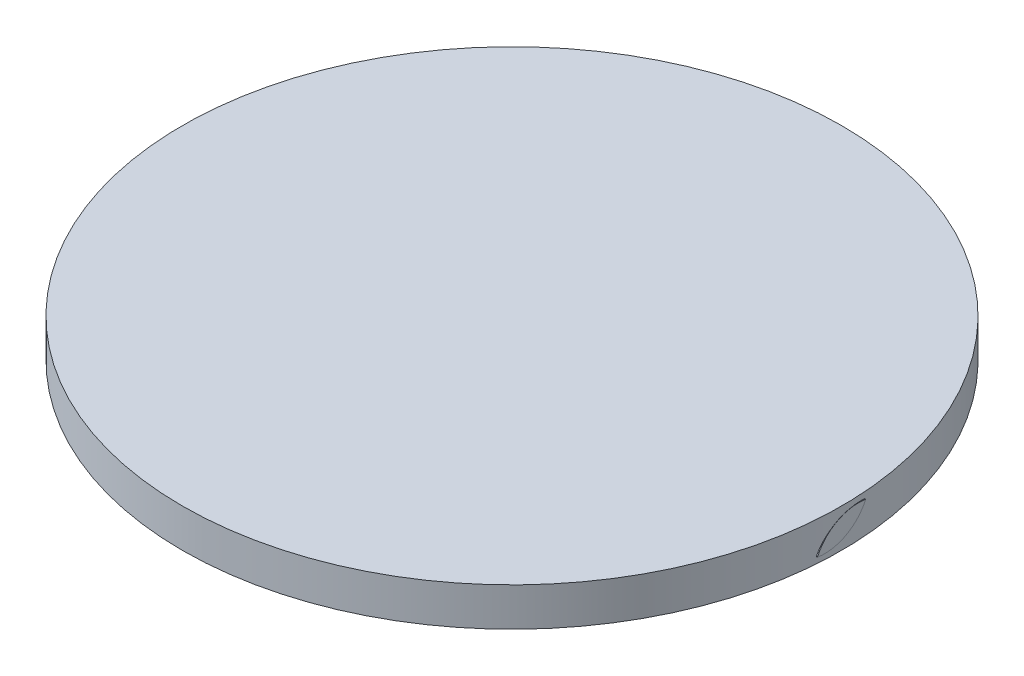
ISO-10303-21;
HEADER;
FILE_DESCRIPTION(('STEP AP214'),'2;1');
FILE_NAME('part.step','',(''),(''),'','','');
FILE_SCHEMA(('AUTOMOTIVE_DESIGN { 1 0 10303 214 1 1 1 1 }'));
ENDSEC;
DATA;
#1=APPLICATION_CONTEXT('core data for automotive mechanical design processes');
#2=APPLICATION_PROTOCOL_DEFINITION('international standard','automotive_design',2000,#1);
#3=PRODUCT_CONTEXT('',#1,'mechanical');
#4=PRODUCT('Part','Part','',(#3));
#5=PRODUCT_RELATED_PRODUCT_CATEGORY('part','',(#4));
#6=PRODUCT_DEFINITION_FORMATION('','',#4);
#7=PRODUCT_DEFINITION_CONTEXT('part definition',#1,'design');
#8=PRODUCT_DEFINITION('design','',#6,#7);
#9=PRODUCT_DEFINITION_SHAPE('','',#8);
#10=(LENGTH_UNIT() NAMED_UNIT(*) SI_UNIT(.MILLI.,.METRE.));
#11=(NAMED_UNIT(*) PLANE_ANGLE_UNIT() SI_UNIT($,.RADIAN.));
#12=(NAMED_UNIT(*) SI_UNIT($,.STERADIAN.) SOLID_ANGLE_UNIT());
#13=UNCERTAINTY_MEASURE_WITH_UNIT(LENGTH_MEASURE(1.E-05),#10,'distance_accuracy_value','');
#14=(GEOMETRIC_REPRESENTATION_CONTEXT(3) GLOBAL_UNCERTAINTY_ASSIGNED_CONTEXT((#13)) GLOBAL_UNIT_ASSIGNED_CONTEXT((#10,
#11,#12)) REPRESENTATION_CONTEXT('',''));
#15=CARTESIAN_POINT('',(0.,0.,0.));
#16=DIRECTION('',(0.,0.,1.));
#17=DIRECTION('',(1.,0.,0.));
#18=AXIS2_PLACEMENT_3D('',#15,#16,#17);
#19=CARTESIAN_POINT('',(0.,176.705627484771,0.));
#20=DIRECTION('',(0.,-1.,0.));
#21=DIRECTION('',(0.,0.,-1.));
#22=AXIS2_PLACEMENT_3D('',#19,#20,#21);
#23=CYLINDRICAL_SURFACE('',#22,60.);
#24=CARTESIAN_POINT('',(0.,0.,0.));
#25=DIRECTION('',(0.,1.,0.));
#26=DIRECTION('',(0.,0.,1.));
#27=AXIS2_PLACEMENT_3D('',#24,#25,#26);
#28=CIRCLE('',#27,60.);
#29=CARTESIAN_POINT('',(0.,0.,60.));
#30=VERTEX_POINT('',#29);
#31=EDGE_CURVE('E65',#30,#30,#28,.T.);
#32=ORIENTED_EDGE('',*,*,#31,.T.);
#33=EDGE_LOOP('',(#32));
#34=FACE_BOUND('',#33,.T.);
#35=CARTESIAN_POINT('',(0.,7.00000000000001,0.));
#36=DIRECTION('',(0.,1.,0.));
#37=DIRECTION('',(0.,0.,1.));
#38=AXIS2_PLACEMENT_3D('',#35,#36,#37);
#39=CIRCLE('',#38,60.);
#40=CARTESIAN_POINT('',(0.,7.00000000000001,60.));
#41=VERTEX_POINT('',#40);
#42=EDGE_CURVE('E11',#41,#41,#39,.T.);
#43=ORIENTED_EDGE('',*,*,#42,.F.);
#44=EDGE_LOOP('',(#43));
#45=FACE_BOUND('',#44,.T.);
#46=ADVANCED_FACE('F57',(#34,#45),#23,.T.);
#47=CARTESIAN_POINT('',(0.,0.,0.));
#48=DIRECTION('',(0.,1.,0.));
#49=DIRECTION('',(0.,0.,1.));
#50=AXIS2_PLACEMENT_3D('',#47,#48,#49);
#51=PLANE('',#50);
#52=ORIENTED_EDGE('',*,*,#31,.F.);
#53=EDGE_LOOP('',(#52));
#54=FACE_BOUND('',#53,.T.);
#55=ADVANCED_FACE('F74',(#54),#51,.F.);
#56=CARTESIAN_POINT('',(0.,7.,0.));
#57=DIRECTION('',(0.,1.,0.));
#58=DIRECTION('',(0.,0.,-1.));
#59=AXIS2_PLACEMENT_3D('',#56,#57,#58);
#60=PLANE('',#59);
#61=ORIENTED_EDGE('',*,*,#42,.T.);
#62=EDGE_LOOP('',(#61));
#63=FACE_BOUND('',#62,.T.);
#64=ADVANCED_FACE('F59',(#63),#60,.T.);
#65=CLOSED_SHELL('',(#46,#55,#64));
#66=MANIFOLD_SOLID_BREP('B2',#65);
#67=CARTESIAN_POINT('',(0.,7.,0.));
#68=DIRECTION('',(0.,1.,0.));
#69=DIRECTION('',(0.,0.,-1.));
#70=AXIS2_PLACEMENT_3D('',#67,#68,#69);
#71=PLANE('',#70);
#72=CARTESIAN_POINT('',(0.,7.,0.));
#73=DIRECTION('',(0.,-1.,0.));
#74=DIRECTION('',(0.,0.,-1.));
#75=AXIS2_PLACEMENT_3D('',#72,#73,#74);
#76=CIRCLE('',#75,6.5);
#77=CARTESIAN_POINT('',(0.,7.,-6.5));
#78=VERTEX_POINT('',#77);
#79=EDGE_CURVE('E193',#78,#78,#76,.T.);
#80=ORIENTED_EDGE('',*,*,#79,.F.);
#81=EDGE_LOOP('',(#80));
#82=FACE_BOUND('',#81,.T.);
#83=CARTESIAN_POINT('',(0.,7.,0.));
#84=DIRECTION('',(0.,-1.,0.));
#85=DIRECTION('',(0.,0.,-1.));
#86=AXIS2_PLACEMENT_3D('',#83,#84,#85);
#87=CIRCLE('',#86,2.5);
#88=CARTESIAN_POINT('',(0.,7.,-2.5));
#89=VERTEX_POINT('',#88);
#90=EDGE_CURVE('E187',#89,#89,#87,.T.);
#91=ORIENTED_EDGE('',*,*,#90,.T.);
#92=EDGE_LOOP('',(#91));
#93=FACE_BOUND('',#92,.T.);
#94=ADVANCED_FACE('F114',(#82,#93),#71,.T.);
#95=CARTESIAN_POINT('',(0.,0.,0.));
#96=DIRECTION('',(0.,1.,0.));
#97=DIRECTION('',(0.,0.,-1.));
#98=AXIS2_PLACEMENT_3D('',#95,#96,#97);
#99=PLANE('',#98);
#100=CARTESIAN_POINT('',(0.,0.,0.));
#101=DIRECTION('',(0.,-1.,0.));
#102=DIRECTION('',(0.,0.,-1.));
#103=AXIS2_PLACEMENT_3D('',#100,#101,#102);
#104=CIRCLE('',#103,6.5);
#105=CARTESIAN_POINT('',(0.,0.,-6.5));
#106=VERTEX_POINT('',#105);
#107=EDGE_CURVE('E190',#106,#106,#104,.T.);
#108=ORIENTED_EDGE('',*,*,#107,.T.);
#109=EDGE_LOOP('',(#108));
#110=FACE_BOUND('',#109,.T.);
#111=CARTESIAN_POINT('',(0.,0.,0.));
#112=DIRECTION('',(0.,-1.,0.));
#113=DIRECTION('',(0.,0.,-1.));
#114=AXIS2_PLACEMENT_3D('',#111,#112,#113);
#115=CIRCLE('',#114,2.5);
#116=CARTESIAN_POINT('',(0.,0.,-2.5));
#117=VERTEX_POINT('',#116);
#118=EDGE_CURVE('E186',#117,#117,#115,.T.);
#119=ORIENTED_EDGE('',*,*,#118,.F.);
#120=EDGE_LOOP('',(#119));
#121=FACE_BOUND('',#120,.T.);
#122=ADVANCED_FACE('F227',(#110,#121),#99,.F.);
#123=CARTESIAN_POINT('',(0.,7.,0.));
#124=DIRECTION('',(0.,-1.,0.));
#125=DIRECTION('',(0.,0.,1.));
#126=AXIS2_PLACEMENT_3D('',#123,#124,#125);
#127=CYLINDRICAL_SURFACE('',#126,6.5);
#128=CARTESIAN_POINT('',(-4.7821821436501,5.87049911517509,4.40235549961087));
#129=CARTESIAN_POINT('',(-4.83064414254382,5.75307849011286,4.34971721674044));
#130=CARTESIAN_POINT('',(-4.87990007531833,5.63718924817442,4.29446194755524));
#131=CARTESIAN_POINT('',(-4.97934252504515,5.40844816549399,4.1787508646116));
#132=CARTESIAN_POINT('',(-5.02952902312219,5.29559626325717,4.11829515624686));
#133=CARTESIAN_POINT('',(-5.18064033294913,4.96124427834919,3.92900023104887));
#134=CARTESIAN_POINT('',(-5.28197964130929,4.74427172089679,3.79237859337446));
#135=CARTESIAN_POINT('',(-5.48201816255056,4.32081778718442,3.49709020025005));
#136=CARTESIAN_POINT('',(-5.58068011473167,4.11446532399425,3.33821366554871));
#137=CARTESIAN_POINT('',(-5.76977191253925,3.71578718343125,2.99954925464827));
#138=CARTESIAN_POINT('',(-5.8602087829891,3.52344956480868,2.81977952748504));
#139=CARTESIAN_POINT('',(-6.00082777656387,3.21498198799895,2.50191697257492));
#140=CARTESIAN_POINT('',(-6.05448191443204,3.09455355994512,2.36950239094969));
#141=CARTESIAN_POINT('',(-6.15469441903155,2.8614116783889,2.09547389795706));
#142=CARTESIAN_POINT('',(-6.2012531335545,2.74869784689459,1.95386043797053));
#143=CARTESIAN_POINT('',(-6.28565115537736,2.53222289336979,1.66238370282706));
#144=CARTESIAN_POINT('',(-6.32352442507828,2.42842792820188,1.51255550140705));
#145=CARTESIAN_POINT('',(-6.38931550033209,2.23017901748577,1.20474113971181));
#146=CARTESIAN_POINT('',(-6.41723496009312,2.13572352171302,1.04675633996961));
#147=CARTESIAN_POINT('',(-6.45807981110886,1.97148438860737,0.749617808270409));
#148=CARTESIAN_POINT('',(-6.47269726112326,1.9001786123533,0.611536570397726));
#149=CARTESIAN_POINT('',(-6.49308830236873,1.76531312347445,0.331015669890624));
#150=CARTESIAN_POINT('',(-6.49886353682219,1.70175197362269,0.188576822086766));
#151=CARTESIAN_POINT('',(-6.5008332970216,1.58282493814278,-0.0997949089279416));
#152=CARTESIAN_POINT('',(-6.49702583145035,1.52746075840377,-0.245728512119164));
#153=CARTESIAN_POINT('',(-6.47920924664528,1.42531356801808,-0.539970665864429));
#154=CARTESIAN_POINT('',(-6.46520004465342,1.37853062698755,-0.688279235675013));
#155=CARTESIAN_POINT('',(-6.42646291900958,1.2936248860239,-0.98654203323697));
#156=CARTESIAN_POINT('',(-6.40169816750957,1.25553253309935,-1.13650017414418));
#157=CARTESIAN_POINT('',(-6.34118974554054,1.1882546389773,-1.43620416867612));
#158=CARTESIAN_POINT('',(-6.30544594839662,1.15906920055443,-1.58595001983144));
#159=CARTESIAN_POINT('',(-6.22293221814679,1.10942888764528,-1.88388290383165));
#160=CARTESIAN_POINT('',(-6.17615939530979,1.08897630522161,-2.03206951749061));
#161=CARTESIAN_POINT('',(-6.07176373348164,1.05643172809972,-2.32549620563955));
#162=CARTESIAN_POINT('',(-6.01414150407575,1.04433926385776,-2.47073644516701));
#163=CARTESIAN_POINT('',(-5.89217105962823,1.02842920447622,-2.74844052835948));
#164=CARTESIAN_POINT('',(-5.82843389016116,1.02415862684524,-2.88114807508317));
#165=CARTESIAN_POINT('',(-5.69204358803965,1.02188505103255,-3.14202373699236));
#166=CARTESIAN_POINT('',(-5.61938651443232,1.02388483283838,-3.2701898132265));
#167=CARTESIAN_POINT('',(-5.46574838862474,1.03344831091795,-3.52096503731605));
#168=CARTESIAN_POINT('',(-5.38477843115619,1.04100467210471,-3.64358128503876));
#169=CARTESIAN_POINT('',(-5.21492630139397,1.06090737931176,-3.8827896587537));
#170=CARTESIAN_POINT('',(-5.12604478774283,1.07325332688252,-3.99938228494179));
#171=CARTESIAN_POINT('',(-4.99295337664244,1.09386181536266,-4.16227380811089));
#172=CARTESIAN_POINT('',(-4.95171979968998,1.10051822811231,-4.21124271502949));
#173=CARTESIAN_POINT('',(-4.86793984185861,1.11451360770791,-4.30781148946805));
#174=CARTESIAN_POINT('',(-4.82539557012069,1.12185151269691,-4.35541334039849));
#175=CARTESIAN_POINT('',(-4.7821821436501,1.12950088482491,-4.40235549961088));
#176=B_SPLINE_CURVE_WITH_KNOTS('',3,(#128,#129,#130,#131,#132,#133,#134,#135,#136,#137,#138,
#139,#140,#141,#142,#143,#144,#145,#146,#147,#148,#149,#150,#151,#152,#153,#154,#155,#156,#157,
#158,#159,#160,#161,#162,#163,#164,#165,#166,#167,#168,#169,#170,#171,#172,#173,#174,#175),
.UNSPECIFIED.,.F.,.F.,(4,2,2,2,2,2,2,2,2,2,2,2,2,2,2,2,2,2,2,2,2,2,2,4),(0.,0.412424395206687,
0.82484043406315,1.65081032526283,2.48516794300089,3.31880613151439,3.87892439803388,
4.43901520077476,4.99687706559019,5.55464617694931,6.02245501526971,6.49017690622934,
6.95799599939028,7.42581888761249,7.89525642556378,8.36469938003175,8.83426547087328,
9.30380518652116,9.74517092170496,10.186732365718,10.6277119606797,11.068654878059,
11.2617154359852,11.4544800709796),.UNSPECIFIED.);
#177=CARTESIAN_POINT('',(-4.7821821436501,5.87049911517509,4.40235549961087));
#178=VERTEX_POINT('',#177);
#179=CARTESIAN_POINT('',(-4.7821821436501,1.12950088482491,-4.40235549961088));
#180=VERTEX_POINT('',#179);
#181=EDGE_CURVE('E128',#178,#180,#176,.T.);
#182=ORIENTED_EDGE('',*,*,#181,.T.);
#183=CARTESIAN_POINT('',(-4.7821821436501,5.87049911517509,4.40235549961088));
#184=CARTESIAN_POINT('',(-4.88766320937093,5.88917689213438,4.28779478186393));
#185=CARTESIAN_POINT('',(-4.98918102694404,5.90599145402247,4.1692347784361));
#186=CARTESIAN_POINT('',(-5.18373646436622,5.93492352011488,3.92469811394374));
#187=CARTESIAN_POINT('',(-5.27676895914507,5.94703819980915,3.79871704522361));
#188=CARTESIAN_POINT('',(-5.45390508052464,5.96559953020935,3.53971840560347));
#189=CARTESIAN_POINT('',(-5.53798453135131,5.97203116016814,3.40668316670556));
#190=CARTESIAN_POINT('',(-5.69631529261127,5.97825307352717,3.13476219869654));
#191=CARTESIAN_POINT('',(-5.77056859359833,5.97804470411424,2.99587766205773));
#192=CARTESIAN_POINT('',(-5.90902452010194,5.97015178852389,2.7126339773875));
#193=CARTESIAN_POINT('',(-5.97318239980489,5.96243499029153,2.5682537944861));
#194=CARTESIAN_POINT('',(-6.09061712125845,5.93878951745358,2.27578802159962));
#195=CARTESIAN_POINT('',(-6.143894564103,5.92286129666264,2.12770263681749));
#196=CARTESIAN_POINT('',(-6.23919524526895,5.88232936195132,1.82945377606943));
#197=CARTESIAN_POINT('',(-6.2812413370792,5.85774350469477,1.67929518404446));
#198=CARTESIAN_POINT('',(-6.35414107008765,5.79959817224028,1.37800941725758));
#199=CARTESIAN_POINT('',(-6.38499543844963,5.76603928029667,1.22688230607313));
#200=CARTESIAN_POINT('',(-6.43408462201875,5.69224109164672,0.934431088851243));
#201=CARTESIAN_POINT('',(-6.45298339903484,5.6525451699426,0.793080285373248));
#202=CARTESIAN_POINT('',(-6.48135958439274,5.56528877725754,0.511822618964511));
#203=CARTESIAN_POINT('',(-6.49083393072099,5.51772575609254,0.37191623993084));
#204=CARTESIAN_POINT('',(-6.50079430575211,5.41496777714514,0.0945553993063757));
#205=CARTESIAN_POINT('',(-6.50127670984996,5.35976975076334,-0.0428980512188811));
#206=CARTESIAN_POINT('',(-6.49381060852867,5.24208690036674,-0.314461143915668));
#207=CARTESIAN_POINT('',(-6.48585889341083,5.17959931028395,-0.448569493185438));
#208=CARTESIAN_POINT('',(-6.46174288433414,5.04537183343341,-0.71746273944143));
#209=CARTESIAN_POINT('',(-6.44529056218441,4.97337818717153,-0.852095019370883));
#210=CARTESIAN_POINT('',(-6.40482220603737,4.82253172550726,-1.11630581914759));
#211=CARTESIAN_POINT('',(-6.38080324747632,4.74367626650476,-1.24588236311385));
#212=CARTESIAN_POINT('',(-6.29860688419894,4.49756347741591,-1.62627681221982));
#213=CARTESIAN_POINT('',(-6.23028134221334,4.32071652591468,-1.86884552350102));
#214=CARTESIAN_POINT('',(-6.0921229865514,3.99071984324681,-2.27382257665893));
#215=CARTESIAN_POINT('',(-6.02658747160085,3.84206916771191,-2.44149744698916));
#216=CARTESIAN_POINT('',(-5.88646051027415,3.53368082112882,-2.76227885246882));
#217=CARTESIAN_POINT('',(-5.81186812654432,3.37394200323139,-2.91538387676101));
#218=CARTESIAN_POINT('',(-5.65617457478009,3.04423666969009,-3.20703367607814));
#219=CARTESIAN_POINT('',(-5.5750638463006,2.87425522604331,-3.34555634963119));
#220=CARTESIAN_POINT('',(-5.40909081937207,2.52506245031342,-3.60774116249649));
#221=CARTESIAN_POINT('',(-5.32423002717874,2.34585481934524,-3.73140919545121));
#222=CARTESIAN_POINT('',(-5.16194158894226,1.9968586946429,-3.95236702600692));
#223=CARTESIAN_POINT('',(-5.0846145929603,1.82790748868391,-4.05105713321269));
#224=CARTESIAN_POINT('',(-4.93165976988153,1.4836157561563,-4.23593553183121));
#225=CARTESIAN_POINT('',(-4.85602617742722,1.30830499222131,-4.32217451101261));
#226=CARTESIAN_POINT('',(-4.7821821436501,1.12950088482492,-4.40235549961087));
#227=B_SPLINE_CURVE_WITH_KNOTS('',3,(#183,#184,#185,#186,#187,#188,#189,#190,#191,#192,#193,
#194,#195,#196,#197,#198,#199,#200,#201,#202,#203,#204,#205,#206,#207,#208,#209,#210,#211,#212,
#213,#214,#215,#216,#217,#218,#219,#220,#221,#222,#223,#224,#225,#226),.UNSPECIFIED.,.F.,.F.,(4,
2,2,2,2,2,2,2,2,2,2,2,2,2,2,2,2,2,2,2,2,4),(0.,0.470464893316255,0.941212087728027,
1.41319981398858,1.88509177945657,2.35901972085607,2.83292147283703,3.30585145706237,
3.77875070793549,4.22232193884454,4.66603723977526,5.10993139616443,5.553994542087,
6.01419983299027,6.47458321549889,7.39506275987095,8.09462715183295,8.79426400803377,
9.4949464349293,10.1953499383263,10.8260555117164,11.4541163880461),.UNSPECIFIED.);
#228=EDGE_CURVE('E55',#178,#180,#227,.T.);
#229=ORIENTED_EDGE('',*,*,#228,.F.);
#230=EDGE_LOOP('',(#182,#229));
#231=FACE_BOUND('',#230,.T.);
#232=CARTESIAN_POINT('',(4.7821821436501,5.87049911517509,-4.40235549961087));
#233=CARTESIAN_POINT('',(4.83064414254382,5.75307849011286,-4.34971721674044));
#234=CARTESIAN_POINT('',(4.87990007531833,5.63718924817442,-4.29446194755524));
#235=CARTESIAN_POINT('',(4.97934252504515,5.40844816549399,-4.1787508646116));
#236=CARTESIAN_POINT('',(5.02952902312219,5.29559626325717,-4.11829515624686));
#237=CARTESIAN_POINT('',(5.18064033294913,4.96124427834919,-3.92900023104887));
#238=CARTESIAN_POINT('',(5.28197964130929,4.74427172089679,-3.79237859337446));
#239=CARTESIAN_POINT('',(5.48201816255056,4.32081778718442,-3.49709020025005));
#240=CARTESIAN_POINT('',(5.58068011473167,4.11446532399425,-3.33821366554871));
#241=CARTESIAN_POINT('',(5.76977191253925,3.71578718343125,-2.99954925464827));
#242=CARTESIAN_POINT('',(5.8602087829891,3.52344956480868,-2.81977952748504));
#243=CARTESIAN_POINT('',(6.00082777656387,3.21498198799895,-2.50191697257492));
#244=CARTESIAN_POINT('',(6.05448191443204,3.09455355994512,-2.36950239094969));
#245=CARTESIAN_POINT('',(6.15469441903155,2.8614116783889,-2.09547389795706));
#246=CARTESIAN_POINT('',(6.2012531335545,2.74869784689459,-1.95386043797053));
#247=CARTESIAN_POINT('',(6.28565115537736,2.53222289336979,-1.66238370282706));
#248=CARTESIAN_POINT('',(6.32352442507828,2.42842792820188,-1.51255550140705));
#249=CARTESIAN_POINT('',(6.38931550033209,2.23017901748577,-1.20474113971181));
#250=CARTESIAN_POINT('',(6.41723496009312,2.13572352171302,-1.04675633996961));
#251=CARTESIAN_POINT('',(6.45807981110886,1.97148438860737,-0.749617808270409));
#252=CARTESIAN_POINT('',(6.47269726112326,1.9001786123533,-0.611536570397726));
#253=CARTESIAN_POINT('',(6.49308830236873,1.76531312347445,-0.331015669890624));
#254=CARTESIAN_POINT('',(6.49886353682219,1.70175197362269,-0.188576822086766));
#255=CARTESIAN_POINT('',(6.5008332970216,1.58282493814278,0.0997949089279416));
#256=CARTESIAN_POINT('',(6.49702583145035,1.52746075840377,0.245728512119164));
#257=CARTESIAN_POINT('',(6.47920924664528,1.42531356801808,0.539970665864429));
#258=CARTESIAN_POINT('',(6.46520004465342,1.37853062698755,0.688279235675013));
#259=CARTESIAN_POINT('',(6.42646291900958,1.2936248860239,0.98654203323697));
#260=CARTESIAN_POINT('',(6.40169816750957,1.25553253309935,1.13650017414418));
#261=CARTESIAN_POINT('',(6.34118974554054,1.1882546389773,1.43620416867612));
#262=CARTESIAN_POINT('',(6.30544594839662,1.15906920055443,1.58595001983144));
#263=CARTESIAN_POINT('',(6.22293221814679,1.10942888764528,1.88388290383165));
#264=CARTESIAN_POINT('',(6.17615939530979,1.08897630522161,2.03206951749061));
#265=CARTESIAN_POINT('',(6.07176373348164,1.05643172809972,2.32549620563955));
#266=CARTESIAN_POINT('',(6.01414150407575,1.04433926385776,2.47073644516701));
#267=CARTESIAN_POINT('',(5.89217105962823,1.02842920447622,2.74844052835948));
#268=CARTESIAN_POINT('',(5.82843389016116,1.02415862684524,2.88114807508317));
#269=CARTESIAN_POINT('',(5.69204358803965,1.02188505103255,3.14202373699236));
#270=CARTESIAN_POINT('',(5.61938651443232,1.02388483283838,3.2701898132265));
#271=CARTESIAN_POINT('',(5.46574838862474,1.03344831091795,3.52096503731605));
#272=CARTESIAN_POINT('',(5.38477843115619,1.04100467210471,3.64358128503876));
#273=CARTESIAN_POINT('',(5.21492630139397,1.06090737931176,3.8827896587537));
#274=CARTESIAN_POINT('',(5.12604478774283,1.07325332688252,3.99938228494179));
#275=CARTESIAN_POINT('',(4.99295337664244,1.09386181536266,4.16227380811089));
#276=CARTESIAN_POINT('',(4.95171979968998,1.10051822811231,4.21124271502949));
#277=CARTESIAN_POINT('',(4.86793984185861,1.11451360770791,4.30781148946805));
#278=CARTESIAN_POINT('',(4.82539557012069,1.12185151269691,4.35541334039849));
#279=CARTESIAN_POINT('',(4.7821821436501,1.12950088482491,4.40235549961088));
#280=B_SPLINE_CURVE_WITH_KNOTS('',3,(#232,#233,#234,#235,#236,#237,#238,#239,#240,#241,#242,
#243,#244,#245,#246,#247,#248,#249,#250,#251,#252,#253,#254,#255,#256,#257,#258,#259,#260,#261,
#262,#263,#264,#265,#266,#267,#268,#269,#270,#271,#272,#273,#274,#275,#276,#277,#278,#279),
.UNSPECIFIED.,.F.,.F.,(4,2,2,2,2,2,2,2,2,2,2,2,2,2,2,2,2,2,2,2,2,2,2,4),(0.,0.412424395206687,
0.82484043406315,1.65081032526283,2.48516794300089,3.31880613151439,3.87892439803388,
4.43901520077476,4.99687706559019,5.55464617694931,6.02245501526971,6.49017690622934,
6.95799599939028,7.42581888761249,7.89525642556378,8.36469938003175,8.83426547087328,
9.30380518652116,9.74517092170496,10.186732365718,10.6277119606797,11.068654878059,
11.2617154359852,11.4544800709796),.UNSPECIFIED.);
#281=CARTESIAN_POINT('',(4.7821821436501,5.87049911517509,-4.40235549961087));
#282=VERTEX_POINT('',#281);
#283=CARTESIAN_POINT('',(4.7821821436501,1.12950088482491,4.40235549961088));
#284=VERTEX_POINT('',#283);
#285=EDGE_CURVE('E196',#282,#284,#280,.T.);
#286=ORIENTED_EDGE('',*,*,#285,.T.);
#287=CARTESIAN_POINT('',(4.7821821436501,5.87049911517509,-4.40235549961088));
#288=CARTESIAN_POINT('',(4.88766320937093,5.88917689213438,-4.28779478186393));
#289=CARTESIAN_POINT('',(4.98918102694404,5.90599145402247,-4.1692347784361));
#290=CARTESIAN_POINT('',(5.18373646436622,5.93492352011488,-3.92469811394374));
#291=CARTESIAN_POINT('',(5.27676895914507,5.94703819980915,-3.79871704522361));
#292=CARTESIAN_POINT('',(5.45390508052464,5.96559953020935,-3.53971840560347));
#293=CARTESIAN_POINT('',(5.53798453135131,5.97203116016814,-3.40668316670556));
#294=CARTESIAN_POINT('',(5.69631529261127,5.97825307352717,-3.13476219869654));
#295=CARTESIAN_POINT('',(5.77056859359833,5.97804470411424,-2.99587766205773));
#296=CARTESIAN_POINT('',(5.90902452010194,5.97015178852389,-2.7126339773875));
#297=CARTESIAN_POINT('',(5.97318239980489,5.96243499029153,-2.5682537944861));
#298=CARTESIAN_POINT('',(6.09061712125845,5.93878951745358,-2.27578802159962));
#299=CARTESIAN_POINT('',(6.143894564103,5.92286129666264,-2.12770263681749));
#300=CARTESIAN_POINT('',(6.23919524526895,5.88232936195132,-1.82945377606943));
#301=CARTESIAN_POINT('',(6.2812413370792,5.85774350469477,-1.67929518404446));
#302=CARTESIAN_POINT('',(6.35414107008765,5.79959817224028,-1.37800941725758));
#303=CARTESIAN_POINT('',(6.38499543844963,5.76603928029667,-1.22688230607313));
#304=CARTESIAN_POINT('',(6.43408462201875,5.69224109164672,-0.934431088851243));
#305=CARTESIAN_POINT('',(6.45298339903484,5.6525451699426,-0.793080285373248));
#306=CARTESIAN_POINT('',(6.48135958439274,5.56528877725754,-0.511822618964511));
#307=CARTESIAN_POINT('',(6.49083393072099,5.51772575609254,-0.37191623993084));
#308=CARTESIAN_POINT('',(6.50079430575211,5.41496777714514,-0.0945553993063757));
#309=CARTESIAN_POINT('',(6.50127670984996,5.35976975076334,0.0428980512188811));
#310=CARTESIAN_POINT('',(6.49381060852867,5.24208690036674,0.314461143915668));
#311=CARTESIAN_POINT('',(6.48585889341083,5.17959931028395,0.448569493185438));
#312=CARTESIAN_POINT('',(6.46174288433414,5.04537183343341,0.71746273944143));
#313=CARTESIAN_POINT('',(6.44529056218441,4.97337818717153,0.852095019370883));
#314=CARTESIAN_POINT('',(6.40482220603737,4.82253172550726,1.11630581914759));
#315=CARTESIAN_POINT('',(6.38080324747632,4.74367626650476,1.24588236311385));
#316=CARTESIAN_POINT('',(6.29860688419894,4.49756347741591,1.62627681221982));
#317=CARTESIAN_POINT('',(6.23028134221334,4.32071652591468,1.86884552350102));
#318=CARTESIAN_POINT('',(6.0921229865514,3.99071984324681,2.27382257665893));
#319=CARTESIAN_POINT('',(6.02658747160085,3.84206916771191,2.44149744698916));
#320=CARTESIAN_POINT('',(5.88646051027415,3.53368082112882,2.76227885246882));
#321=CARTESIAN_POINT('',(5.81186812654432,3.37394200323139,2.91538387676101));
#322=CARTESIAN_POINT('',(5.65617457478009,3.04423666969009,3.20703367607814));
#323=CARTESIAN_POINT('',(5.5750638463006,2.87425522604331,3.34555634963119));
#324=CARTESIAN_POINT('',(5.40909081937207,2.52506245031342,3.60774116249649));
#325=CARTESIAN_POINT('',(5.32423002717874,2.34585481934524,3.73140919545121));
#326=CARTESIAN_POINT('',(5.16194158894226,1.9968586946429,3.95236702600692));
#327=CARTESIAN_POINT('',(5.0846145929603,1.82790748868391,4.05105713321269));
#328=CARTESIAN_POINT('',(4.93165976988153,1.4836157561563,4.23593553183121));
#329=CARTESIAN_POINT('',(4.85602617742722,1.30830499222131,4.32217451101261));
#330=CARTESIAN_POINT('',(4.7821821436501,1.12950088482492,4.40235549961087));
#331=B_SPLINE_CURVE_WITH_KNOTS('',3,(#287,#288,#289,#290,#291,#292,#293,#294,#295,#296,#297,
#298,#299,#300,#301,#302,#303,#304,#305,#306,#307,#308,#309,#310,#311,#312,#313,#314,#315,#316,
#317,#318,#319,#320,#321,#322,#323,#324,#325,#326,#327,#328,#329,#330),.UNSPECIFIED.,.F.,.F.,(4,
2,2,2,2,2,2,2,2,2,2,2,2,2,2,2,2,2,2,2,2,4),(0.,0.470464893316255,0.941212087728027,
1.41319981398858,1.88509177945657,2.35901972085607,2.83292147283703,3.30585145706237,
3.77875070793549,4.22232193884454,4.66603723977526,5.10993139616443,5.553994542087,
6.01419983299027,6.47458321549889,7.39506275987095,8.09462715183295,8.79426400803377,
9.4949464349293,10.1953499383263,10.8260555117164,11.4541163880461),.UNSPECIFIED.);
#332=EDGE_CURVE('E206',#282,#284,#331,.T.);
#333=ORIENTED_EDGE('',*,*,#332,.F.);
#334=EDGE_LOOP('',(#286,#333));
#335=FACE_BOUND('',#334,.T.);
#336=ORIENTED_EDGE('',*,*,#79,.T.);
#337=EDGE_LOOP('',(#336));
#338=FACE_BOUND('',#337,.T.);
#339=ORIENTED_EDGE('',*,*,#107,.F.);
#340=EDGE_LOOP('',(#339));
#341=FACE_BOUND('',#340,.T.);
#342=ADVANCED_FACE('F116',(#231,#335,#338,#341),#127,.T.);
#343=CARTESIAN_POINT('',(0.,7.,0.));
#344=DIRECTION('',(0.,-1.,0.));
#345=DIRECTION('',(0.,0.,1.));
#346=AXIS2_PLACEMENT_3D('',#343,#344,#345);
#347=CYLINDRICAL_SURFACE('',#346,2.5);
#348=ORIENTED_EDGE('',*,*,#90,.F.);
#349=EDGE_LOOP('',(#348));
#350=FACE_BOUND('',#349,.T.);
#351=ORIENTED_EDGE('',*,*,#118,.T.);
#352=EDGE_LOOP('',(#351));
#353=FACE_BOUND('',#352,.T.);
#354=ADVANCED_FACE('F222',(#350,#353),#347,.F.);
#355=CARTESIAN_POINT('',(60.,-2.22565177037629,-3.08304326097185));
#356=DIRECTION('',(-1.,0.,0.));
#357=DIRECTION('',(0.,0.,-1.));
#358=AXIS2_PLACEMENT_3D('',#355,#356,#357);
#359=CYLINDRICAL_SURFACE('',#358,8.20294117647061);
#360=ORIENTED_EDGE('',*,*,#332,.T.);
#361=DIRECTION('',(-1.,0.,0.));
#362=VECTOR('',#361,1.);
#363=CARTESIAN_POINT('',(60.,1.12950088482491,4.40235549961088));
#364=LINE('',#363,#362);
#365=CARTESIAN_POINT('',(60.,1.12950088482491,4.40235549961088));
#366=VERTEX_POINT('',#365);
#367=EDGE_CURVE('E183',#366,#284,#364,.T.);
#368=ORIENTED_EDGE('',*,*,#367,.F.);
#369=CARTESIAN_POINT('',(60.,-2.22565177037629,-3.08304326097185));
#370=DIRECTION('',(-1.,0.,0.));
#371=DIRECTION('',(0.,0.,1.));
#372=AXIS2_PLACEMENT_3D('',#369,#370,#371);
#373=CIRCLE('',#372,8.20294117647061);
#374=CARTESIAN_POINT('',(60.,5.87049911517509,-4.40235549961088));
#375=VERTEX_POINT('',#374);
#376=EDGE_CURVE('E173',#375,#366,#373,.F.);
#377=ORIENTED_EDGE('',*,*,#376,.F.);
#378=DIRECTION('',(-1.,0.,0.));
#379=VECTOR('',#378,1.);
#380=CARTESIAN_POINT('',(60.,5.87049911517509,-4.40235549961088));
#381=LINE('',#380,#379);
#382=EDGE_CURVE('E142',#375,#282,#381,.T.);
#383=ORIENTED_EDGE('',*,*,#382,.T.);
#384=EDGE_LOOP('',(#360,#368,#377,#383));
#385=FACE_BOUND('',#384,.T.);
#386=ADVANCED_FACE('F217',(#385),#359,.T.);
#387=CARTESIAN_POINT('',(60.,9.2256517703763,3.08304326097185));
#388=DIRECTION('',(-1.,0.,0.));
#389=DIRECTION('',(0.,0.,-1.));
#390=AXIS2_PLACEMENT_3D('',#387,#388,#389);
#391=CYLINDRICAL_SURFACE('',#390,8.20294117647062);
#392=ORIENTED_EDGE('',*,*,#382,.F.);
#393=CARTESIAN_POINT('',(60.,9.2256517703763,3.08304326097185));
#394=DIRECTION('',(-1.,0.,0.));
#395=DIRECTION('',(0.,0.,1.));
#396=AXIS2_PLACEMENT_3D('',#393,#394,#395);
#397=CIRCLE('',#396,8.20294117647062);
#398=EDGE_CURVE('E181',#375,#366,#397,.T.);
#399=ORIENTED_EDGE('',*,*,#398,.T.);
#400=ORIENTED_EDGE('',*,*,#367,.T.);
#401=ORIENTED_EDGE('',*,*,#285,.F.);
#402=EDGE_LOOP('',(#392,#399,#400,#401));
#403=FACE_BOUND('',#402,.T.);
#404=ADVANCED_FACE('F212',(#403),#391,.T.);
#405=CARTESIAN_POINT('',(60.,0.,0.));
#406=DIRECTION('',(1.,0.,0.));
#407=DIRECTION('',(0.,0.,1.));
#408=AXIS2_PLACEMENT_3D('',#405,#406,#407);
#409=PLANE('',#408);
#410=ORIENTED_EDGE('',*,*,#376,.T.);
#411=ORIENTED_EDGE('',*,*,#398,.F.);
#412=EDGE_LOOP('',(#410,#411));
#413=FACE_BOUND('',#412,.T.);
#414=ADVANCED_FACE('F216',(#413),#409,.T.);
#415=CARTESIAN_POINT('',(-60.,-2.22565177037629,3.08304326097185));
#416=DIRECTION('',(1.,0.,0.));
#417=DIRECTION('',(0.,0.,1.));
#418=AXIS2_PLACEMENT_3D('',#415,#416,#417);
#419=CYLINDRICAL_SURFACE('',#418,8.20294117647061);
#420=ORIENTED_EDGE('',*,*,#228,.T.);
#421=DIRECTION('',(1.,0.,0.));
#422=VECTOR('',#421,1.);
#423=CARTESIAN_POINT('',(-60.,1.12950088482491,-4.40235549961088));
#424=LINE('',#423,#422);
#425=CARTESIAN_POINT('',(-60.,1.12950088482491,-4.40235549961088));
#426=VERTEX_POINT('',#425);
#427=EDGE_CURVE('E168',#426,#180,#424,.T.);
#428=ORIENTED_EDGE('',*,*,#427,.F.);
#429=CARTESIAN_POINT('',(-60.,-2.22565177037629,3.08304326097185));
#430=DIRECTION('',(1.,0.,0.));
#431=DIRECTION('',(0.,0.,-1.));
#432=AXIS2_PLACEMENT_3D('',#429,#430,#431);
#433=CIRCLE('',#432,8.20294117647061);
#434=CARTESIAN_POINT('',(-60.,5.87049911517509,4.40235549961088));
#435=VERTEX_POINT('',#434);
#436=EDGE_CURVE('E165',#435,#426,#433,.F.);
#437=ORIENTED_EDGE('',*,*,#436,.F.);
#438=DIRECTION('',(1.,0.,0.));
#439=VECTOR('',#438,1.);
#440=CARTESIAN_POINT('',(-60.,5.87049911517509,4.40235549961088));
#441=LINE('',#440,#439);
#442=EDGE_CURVE('E134',#435,#178,#441,.T.);
#443=ORIENTED_EDGE('',*,*,#442,.T.);
#444=EDGE_LOOP('',(#420,#428,#437,#443));
#445=FACE_BOUND('',#444,.T.);
#446=ADVANCED_FACE('F175',(#445),#419,.T.);
#447=CARTESIAN_POINT('',(-60.,9.2256517703763,-3.08304326097185));
#448=DIRECTION('',(1.,0.,0.));
#449=DIRECTION('',(0.,0.,1.));
#450=AXIS2_PLACEMENT_3D('',#447,#448,#449);
#451=CYLINDRICAL_SURFACE('',#450,8.20294117647062);
#452=ORIENTED_EDGE('',*,*,#442,.F.);
#453=CARTESIAN_POINT('',(-60.,9.2256517703763,-3.08304326097185));
#454=DIRECTION('',(1.,0.,0.));
#455=DIRECTION('',(0.,0.,-1.));
#456=AXIS2_PLACEMENT_3D('',#453,#454,#455);
#457=CIRCLE('',#456,8.20294117647062);
#458=EDGE_CURVE('E163',#435,#426,#457,.T.);
#459=ORIENTED_EDGE('',*,*,#458,.T.);
#460=ORIENTED_EDGE('',*,*,#427,.T.);
#461=ORIENTED_EDGE('',*,*,#181,.F.);
#462=EDGE_LOOP('',(#452,#459,#460,#461));
#463=FACE_BOUND('',#462,.T.);
#464=ADVANCED_FACE('F171',(#463),#451,.T.);
#465=CARTESIAN_POINT('',(-60.,0.,0.));
#466=DIRECTION('',(-1.,0.,0.));
#467=DIRECTION('',(0.,0.,-1.));
#468=AXIS2_PLACEMENT_3D('',#465,#466,#467);
#469=PLANE('',#468);
#470=ORIENTED_EDGE('',*,*,#436,.T.);
#471=ORIENTED_EDGE('',*,*,#458,.F.);
#472=EDGE_LOOP('',(#470,#471));
#473=FACE_BOUND('',#472,.T.);
#474=ADVANCED_FACE('F164',(#473),#469,.T.);
#475=CLOSED_SHELL('',(#94,#122,#342,#354,#386,#404,#414,#446,#464,#474));
#476=MANIFOLD_SOLID_BREP('B6',#475);
#477=ADVANCED_BREP_SHAPE_REPRESENTATION('',(#18,#66,#476),#14);
#478=SHAPE_DEFINITION_REPRESENTATION(#9,#477);
ENDSEC;
END-ISO-10303-21;
